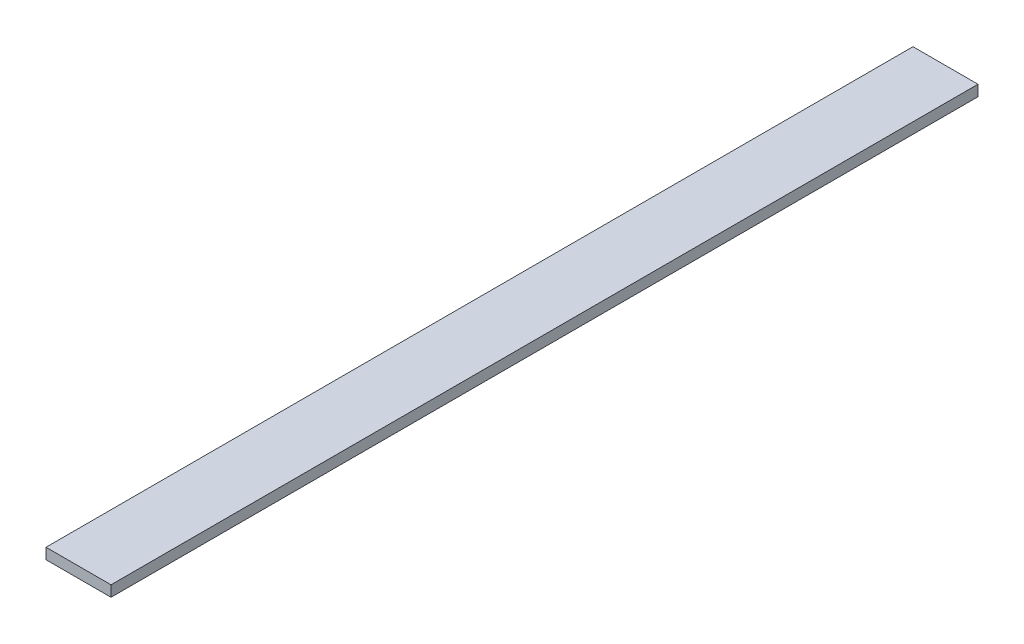
ISO-10303-21;
HEADER;
FILE_DESCRIPTION(('STEP AP214'),'2;1');
FILE_NAME('part.step','',(''),(''),'','','');
FILE_SCHEMA(('AUTOMOTIVE_DESIGN { 1 0 10303 214 1 1 1 1 }'));
ENDSEC;
DATA;
#1=APPLICATION_CONTEXT('core data for automotive mechanical design processes');
#2=APPLICATION_PROTOCOL_DEFINITION('international standard','automotive_design',2000,#1);
#3=PRODUCT_CONTEXT('',#1,'mechanical');
#4=PRODUCT('Part','Part','',(#3));
#5=PRODUCT_RELATED_PRODUCT_CATEGORY('part','',(#4));
#6=PRODUCT_DEFINITION_FORMATION('','',#4);
#7=PRODUCT_DEFINITION_CONTEXT('part definition',#1,'design');
#8=PRODUCT_DEFINITION('design','',#6,#7);
#9=PRODUCT_DEFINITION_SHAPE('','',#8);
#10=(LENGTH_UNIT() NAMED_UNIT(*) SI_UNIT(.MILLI.,.METRE.));
#11=(NAMED_UNIT(*) PLANE_ANGLE_UNIT() SI_UNIT($,.RADIAN.));
#12=(NAMED_UNIT(*) SI_UNIT($,.STERADIAN.) SOLID_ANGLE_UNIT());
#13=UNCERTAINTY_MEASURE_WITH_UNIT(LENGTH_MEASURE(1.E-05),#10,'distance_accuracy_value','');
#14=(GEOMETRIC_REPRESENTATION_CONTEXT(3) GLOBAL_UNCERTAINTY_ASSIGNED_CONTEXT((#13)) GLOBAL_UNIT_ASSIGNED_CONTEXT((#10,
#11,#12)) REPRESENTATION_CONTEXT('',''));
#15=CARTESIAN_POINT('',(0.,0.,0.));
#16=DIRECTION('',(0.,0.,1.));
#17=DIRECTION('',(1.,0.,0.));
#18=AXIS2_PLACEMENT_3D('',#15,#16,#17);
#19=CARTESIAN_POINT('',(0.,2.5,0.));
#20=DIRECTION('',(1.,0.,0.));
#21=DIRECTION('',(0.,0.,-1.));
#22=AXIS2_PLACEMENT_3D('',#19,#20,#21);
#23=PLANE('',#22);
#24=DIRECTION('',(0.,0.,1.));
#25=VECTOR('',#24,1.);
#26=CARTESIAN_POINT('',(0.,0.,0.));
#27=LINE('',#26,#25);
#28=CARTESIAN_POINT('',(0.,0.,0.));
#29=VERTEX_POINT('',#28);
#30=CARTESIAN_POINT('',(0.,0.,200.));
#31=VERTEX_POINT('',#30);
#32=EDGE_CURVE('E102',#29,#31,#27,.T.);
#33=ORIENTED_EDGE('',*,*,#32,.T.);
#34=DIRECTION('',(0.,-1.,0.));
#35=VECTOR('',#34,1.);
#36=CARTESIAN_POINT('',(0.,2.5,200.));
#37=LINE('',#36,#35);
#38=CARTESIAN_POINT('',(0.,2.5,200.));
#39=VERTEX_POINT('',#38);
#40=EDGE_CURVE('E11',#39,#31,#37,.T.);
#41=ORIENTED_EDGE('',*,*,#40,.F.);
#42=DIRECTION('',(0.,0.,1.));
#43=VECTOR('',#42,1.);
#44=CARTESIAN_POINT('',(0.,2.5,0.));
#45=LINE('',#44,#43);
#46=CARTESIAN_POINT('',(0.,2.5,0.));
#47=VERTEX_POINT('',#46);
#48=EDGE_CURVE('E90',#47,#39,#45,.T.);
#49=ORIENTED_EDGE('',*,*,#48,.F.);
#50=DIRECTION('',(0.,-1.,0.));
#51=VECTOR('',#50,1.);
#52=CARTESIAN_POINT('',(0.,2.5,0.));
#53=LINE('',#52,#51);
#54=EDGE_CURVE('E98',#47,#29,#53,.T.);
#55=ORIENTED_EDGE('',*,*,#54,.T.);
#56=EDGE_LOOP('',(#33,#41,#49,#55));
#57=FACE_BOUND('',#56,.T.);
#58=ADVANCED_FACE('F39',(#57),#23,.F.);
#59=CARTESIAN_POINT('',(0.,2.5,200.));
#60=DIRECTION('',(0.,0.,-1.));
#61=DIRECTION('',(-1.,0.,0.));
#62=AXIS2_PLACEMENT_3D('',#59,#60,#61);
#63=PLANE('',#62);
#64=DIRECTION('',(1.,0.,0.));
#65=VECTOR('',#64,1.);
#66=CARTESIAN_POINT('',(0.,0.,200.));
#67=LINE('',#66,#65);
#68=CARTESIAN_POINT('',(15.,0.,200.));
#69=VERTEX_POINT('',#68);
#70=EDGE_CURVE('E94',#31,#69,#67,.T.);
#71=ORIENTED_EDGE('',*,*,#70,.T.);
#72=DIRECTION('',(0.,-1.,0.));
#73=VECTOR('',#72,1.);
#74=CARTESIAN_POINT('',(15.,2.5,200.));
#75=LINE('',#74,#73);
#76=CARTESIAN_POINT('',(15.,2.5,200.));
#77=VERTEX_POINT('',#76);
#78=EDGE_CURVE('E47',#77,#69,#75,.T.);
#79=ORIENTED_EDGE('',*,*,#78,.F.);
#80=DIRECTION('',(1.,0.,0.));
#81=VECTOR('',#80,1.);
#82=CARTESIAN_POINT('',(0.,2.5,200.));
#83=LINE('',#82,#81);
#84=EDGE_CURVE('E85',#39,#77,#83,.T.);
#85=ORIENTED_EDGE('',*,*,#84,.F.);
#86=ORIENTED_EDGE('',*,*,#40,.T.);
#87=EDGE_LOOP('',(#71,#79,#85,#86));
#88=FACE_BOUND('',#87,.T.);
#89=ADVANCED_FACE('F93',(#88),#63,.F.);
#90=CARTESIAN_POINT('',(15.,2.5,0.));
#91=DIRECTION('',(-1.,0.,0.));
#92=DIRECTION('',(0.,0.,1.));
#93=AXIS2_PLACEMENT_3D('',#90,#91,#92);
#94=PLANE('',#93);
#95=DIRECTION('',(0.,0.,-1.));
#96=VECTOR('',#95,1.);
#97=CARTESIAN_POINT('',(15.,0.,0.));
#98=LINE('',#97,#96);
#99=CARTESIAN_POINT('',(15.,0.,0.));
#100=VERTEX_POINT('',#99);
#101=EDGE_CURVE('E72',#69,#100,#98,.T.);
#102=ORIENTED_EDGE('',*,*,#101,.T.);
#103=DIRECTION('',(0.,-1.,0.));
#104=VECTOR('',#103,1.);
#105=CARTESIAN_POINT('',(15.,2.5,0.));
#106=LINE('',#105,#104);
#107=CARTESIAN_POINT('',(15.,2.5,0.));
#108=VERTEX_POINT('',#107);
#109=EDGE_CURVE('E95',#108,#100,#106,.T.);
#110=ORIENTED_EDGE('',*,*,#109,.F.);
#111=DIRECTION('',(0.,0.,-1.));
#112=VECTOR('',#111,1.);
#113=CARTESIAN_POINT('',(15.,2.5,0.));
#114=LINE('',#113,#112);
#115=EDGE_CURVE('E88',#77,#108,#114,.T.);
#116=ORIENTED_EDGE('',*,*,#115,.F.);
#117=ORIENTED_EDGE('',*,*,#78,.T.);
#118=EDGE_LOOP('',(#102,#110,#116,#117));
#119=FACE_BOUND('',#118,.T.);
#120=ADVANCED_FACE('F96',(#119),#94,.F.);
#121=CARTESIAN_POINT('',(0.,2.5,0.));
#122=DIRECTION('',(0.,0.,1.));
#123=DIRECTION('',(1.,0.,0.));
#124=AXIS2_PLACEMENT_3D('',#121,#122,#123);
#125=PLANE('',#124);
#126=DIRECTION('',(-1.,0.,0.));
#127=VECTOR('',#126,1.);
#128=CARTESIAN_POINT('',(0.,0.,0.));
#129=LINE('',#128,#127);
#130=EDGE_CURVE('E78',#100,#29,#129,.T.);
#131=ORIENTED_EDGE('',*,*,#130,.T.);
#132=ORIENTED_EDGE('',*,*,#54,.F.);
#133=DIRECTION('',(-1.,0.,0.));
#134=VECTOR('',#133,1.);
#135=CARTESIAN_POINT('',(0.,2.5,0.));
#136=LINE('',#135,#134);
#137=EDGE_CURVE('E55',#108,#47,#136,.T.);
#138=ORIENTED_EDGE('',*,*,#137,.F.);
#139=ORIENTED_EDGE('',*,*,#109,.T.);
#140=EDGE_LOOP('',(#131,#132,#138,#139));
#141=FACE_BOUND('',#140,.T.);
#142=ADVANCED_FACE('F109',(#141),#125,.F.);
#143=CARTESIAN_POINT('',(0.,2.5,0.));
#144=DIRECTION('',(0.,1.,0.));
#145=DIRECTION('',(0.,0.,1.));
#146=AXIS2_PLACEMENT_3D('',#143,#144,#145);
#147=PLANE('',#146);
#148=ORIENTED_EDGE('',*,*,#48,.T.);
#149=ORIENTED_EDGE('',*,*,#84,.T.);
#150=ORIENTED_EDGE('',*,*,#115,.T.);
#151=ORIENTED_EDGE('',*,*,#137,.T.);
#152=EDGE_LOOP('',(#148,#149,#150,#151));
#153=FACE_BOUND('',#152,.T.);
#154=ADVANCED_FACE('F86',(#153),#147,.T.);
#155=CARTESIAN_POINT('',(0.,0.,0.));
#156=DIRECTION('',(0.,1.,0.));
#157=DIRECTION('',(0.,0.,1.));
#158=AXIS2_PLACEMENT_3D('',#155,#156,#157);
#159=PLANE('',#158);
#160=ORIENTED_EDGE('',*,*,#32,.F.);
#161=ORIENTED_EDGE('',*,*,#130,.F.);
#162=ORIENTED_EDGE('',*,*,#101,.F.);
#163=ORIENTED_EDGE('',*,*,#70,.F.);
#164=EDGE_LOOP('',(#160,#161,#162,#163));
#165=FACE_BOUND('',#164,.T.);
#166=ADVANCED_FACE('F112',(#165),#159,.F.);
#167=CLOSED_SHELL('',(#58,#89,#120,#142,#154,#166));
#168=MANIFOLD_SOLID_BREP('B2',#167);
#169=ADVANCED_BREP_SHAPE_REPRESENTATION('',(#18,#168),#14);
#170=SHAPE_DEFINITION_REPRESENTATION(#9,#169);
ENDSEC;
END-ISO-10303-21;
